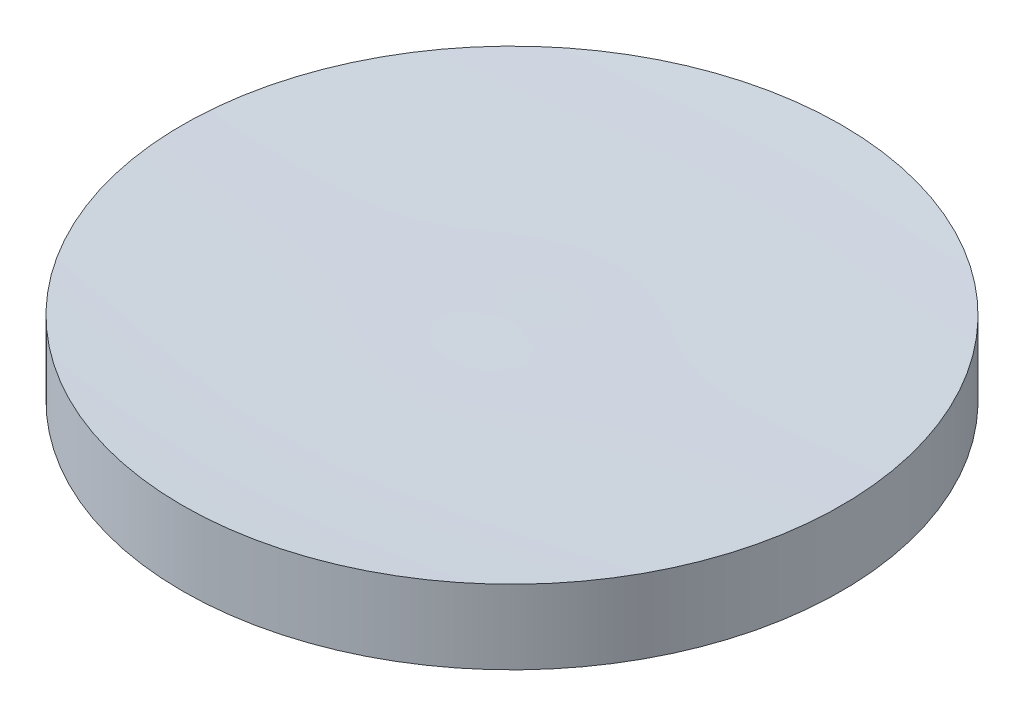
ISO-10303-21;
HEADER;
FILE_DESCRIPTION(('STEP AP214'),'2;1');
FILE_NAME('part.step','',(''),(''),'','','');
FILE_SCHEMA(('AUTOMOTIVE_DESIGN { 1 0 10303 214 1 1 1 1 }'));
ENDSEC;
DATA;
#1=APPLICATION_CONTEXT('core data for automotive mechanical design processes');
#2=APPLICATION_PROTOCOL_DEFINITION('international standard','automotive_design',2000,#1);
#3=PRODUCT_CONTEXT('',#1,'mechanical');
#4=PRODUCT('Part','Part','',(#3));
#5=PRODUCT_RELATED_PRODUCT_CATEGORY('part','',(#4));
#6=PRODUCT_DEFINITION_FORMATION('','',#4);
#7=PRODUCT_DEFINITION_CONTEXT('part definition',#1,'design');
#8=PRODUCT_DEFINITION('design','',#6,#7);
#9=PRODUCT_DEFINITION_SHAPE('','',#8);
#10=(LENGTH_UNIT() NAMED_UNIT(*) SI_UNIT(.MILLI.,.METRE.));
#11=(NAMED_UNIT(*) PLANE_ANGLE_UNIT() SI_UNIT($,.RADIAN.));
#12=(NAMED_UNIT(*) SI_UNIT($,.STERADIAN.) SOLID_ANGLE_UNIT());
#13=UNCERTAINTY_MEASURE_WITH_UNIT(LENGTH_MEASURE(1.E-05),#10,'distance_accuracy_value','');
#14=(GEOMETRIC_REPRESENTATION_CONTEXT(3) GLOBAL_UNCERTAINTY_ASSIGNED_CONTEXT((#13)) GLOBAL_UNIT_ASSIGNED_CONTEXT((#10,
#11,#12)) REPRESENTATION_CONTEXT('',''));
#15=CARTESIAN_POINT('',(0.,0.,0.));
#16=DIRECTION('',(0.,0.,1.));
#17=DIRECTION('',(1.,0.,0.));
#18=AXIS2_PLACEMENT_3D('',#15,#16,#17);
#19=CARTESIAN_POINT('',(0.,18.,0.));
#20=DIRECTION('',(0.,-1.,0.));
#21=DIRECTION('',(0.,0.,-1.));
#22=AXIS2_PLACEMENT_3D('',#19,#20,#21);
#23=CYLINDRICAL_SURFACE('',#22,80.);
#24=CARTESIAN_POINT('',(0.,18.,0.));
#25=DIRECTION('',(0.,-1.,0.));
#26=DIRECTION('',(0.,0.,-1.));
#27=AXIS2_PLACEMENT_3D('',#24,#25,#26);
#28=CIRCLE('',#27,80.);
#29=CARTESIAN_POINT('',(0.,18.,-80.));
#30=VERTEX_POINT('',#29);
#31=EDGE_CURVE('E46',#30,#30,#28,.T.);
#32=ORIENTED_EDGE('',*,*,#31,.T.);
#33=EDGE_LOOP('',(#32));
#34=FACE_BOUND('',#33,.T.);
#35=CARTESIAN_POINT('',(0.,0.,0.));
#36=DIRECTION('',(0.,1.,0.));
#37=DIRECTION('',(0.,0.,1.));
#38=AXIS2_PLACEMENT_3D('',#35,#36,#37);
#39=CIRCLE('',#38,80.);
#40=CARTESIAN_POINT('',(0.,0.,80.));
#41=VERTEX_POINT('',#40);
#42=EDGE_CURVE('E11',#41,#41,#39,.T.);
#43=ORIENTED_EDGE('',*,*,#42,.T.);
#44=EDGE_LOOP('',(#43));
#45=FACE_BOUND('',#44,.T.);
#46=ADVANCED_FACE('F39',(#34,#45),#23,.T.);
#47=CARTESIAN_POINT('',(0.,0.,0.));
#48=DIRECTION('',(0.,1.,0.));
#49=DIRECTION('',(0.,0.,1.));
#50=AXIS2_PLACEMENT_3D('',#47,#48,#49);
#51=PLANE('',#50);
#52=ORIENTED_EDGE('',*,*,#42,.F.);
#53=EDGE_LOOP('',(#52));
#54=FACE_BOUND('',#53,.T.);
#55=ADVANCED_FACE('F51',(#54),#51,.F.);
#56=CARTESIAN_POINT('',(0.,1311.61398310268,-20.1012293847965));
#57=DIRECTION('',(-1.,0.,0.));
#58=DIRECTION('',(0.,0.,-1.));
#59=AXIS2_PLACEMENT_3D('',#56,#57,#58);
#60=CIRCLE('',#59,1295.);
#61=TRIMMED_CURVE('',#60,(PARAMETER_VALUE(-1.58631913503022)),
(PARAMETER_VALUE(1.58631913503022)),.T.,.PARAMETER.);
#62=CARTESIAN_POINT('',(0.,1311.61398310268,0.));
#63=DIRECTION('',(0.,-1.,0.));
#64=AXIS1_PLACEMENT('',#62,#63);
#65=SURFACE_OF_REVOLUTION('',#61,#64);
#66=ORIENTED_EDGE('',*,*,#31,.F.);
#67=EDGE_LOOP('',(#66));
#68=FACE_BOUND('',#67,.T.);
#69=CARTESIAN_POINT('',(0.,16.77,0.));
#70=VERTEX_POINT('',#69);
#71=VERTEX_LOOP('',#70);
#72=FACE_BOUND('',#71,.T.);
#73=ADVANCED_FACE('F49',(#68,#72),#65,.F.);
#74=CLOSED_SHELL('',(#46,#55,#73));
#75=MANIFOLD_SOLID_BREP('B2',#74);
#76=ADVANCED_BREP_SHAPE_REPRESENTATION('',(#18,#75),#14);
#77=SHAPE_DEFINITION_REPRESENTATION(#9,#76);
ENDSEC;
END-ISO-10303-21;
